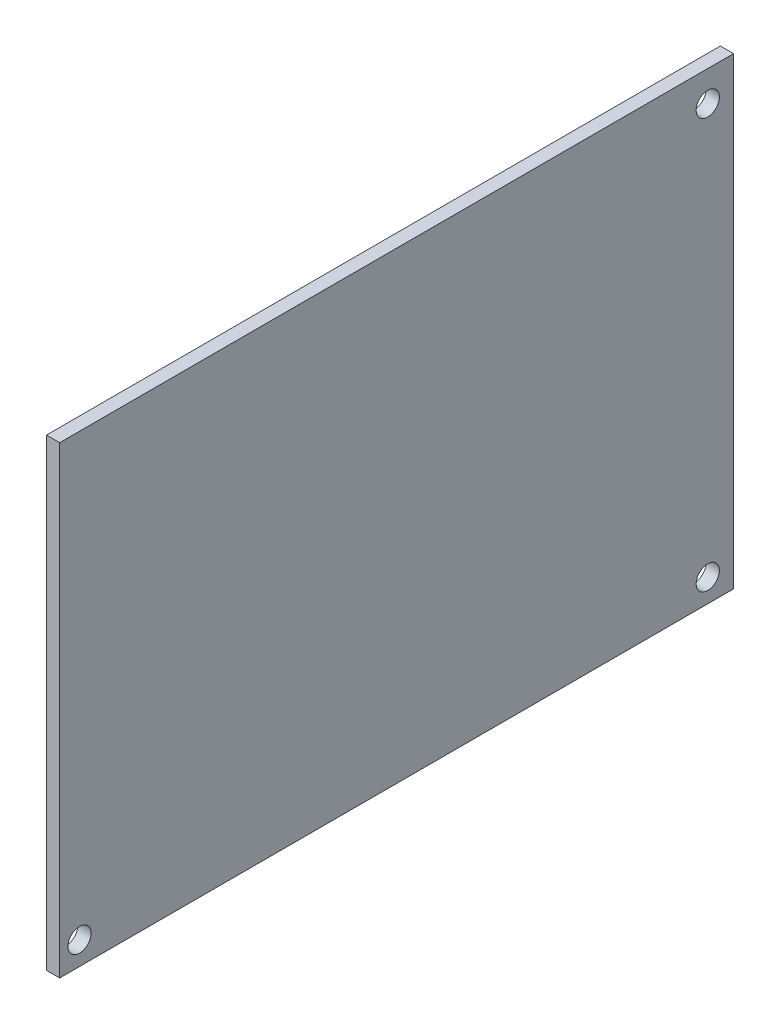
ISO-10303-21;
HEADER;
FILE_DESCRIPTION(('STEP AP214'),'2;1');
FILE_NAME('part.step','',(''),(''),'','','');
FILE_SCHEMA(('AUTOMOTIVE_DESIGN { 1 0 10303 214 1 1 1 1 }'));
ENDSEC;
DATA;
#1=APPLICATION_CONTEXT('core data for automotive mechanical design processes');
#2=APPLICATION_PROTOCOL_DEFINITION('international standard','automotive_design',2000,#1);
#3=PRODUCT_CONTEXT('',#1,'mechanical');
#4=PRODUCT('Part','Part','',(#3));
#5=PRODUCT_RELATED_PRODUCT_CATEGORY('part','',(#4));
#6=PRODUCT_DEFINITION_FORMATION('','',#4);
#7=PRODUCT_DEFINITION_CONTEXT('part definition',#1,'design');
#8=PRODUCT_DEFINITION('design','',#6,#7);
#9=PRODUCT_DEFINITION_SHAPE('','',#8);
#10=(LENGTH_UNIT() NAMED_UNIT(*) SI_UNIT(.MILLI.,.METRE.));
#11=(NAMED_UNIT(*) PLANE_ANGLE_UNIT() SI_UNIT($,.RADIAN.));
#12=(NAMED_UNIT(*) SI_UNIT($,.STERADIAN.) SOLID_ANGLE_UNIT());
#13=UNCERTAINTY_MEASURE_WITH_UNIT(LENGTH_MEASURE(1.E-05),#10,'distance_accuracy_value','');
#14=(GEOMETRIC_REPRESENTATION_CONTEXT(3) GLOBAL_UNCERTAINTY_ASSIGNED_CONTEXT((#13)) GLOBAL_UNIT_ASSIGNED_CONTEXT((#10,
#11,#12)) REPRESENTATION_CONTEXT('',''));
#15=CARTESIAN_POINT('',(0.,0.,0.));
#16=DIRECTION('',(0.,0.,1.));
#17=DIRECTION('',(1.,0.,0.));
#18=AXIS2_PLACEMENT_3D('',#15,#16,#17);
#19=CARTESIAN_POINT('',(3.71328924651546,28.4789231101329,109.500000000026));
#20=DIRECTION('',(-1.,0.,0.));
#21=DIRECTION('',(0.,-1.,0.));
#22=AXIS2_PLACEMENT_3D('',#19,#20,#21);
#23=PLANE('',#22);
#24=CARTESIAN_POINT('',(3.71328924651546,-38.1210768898671,106.500000000026));
#25=DIRECTION('',(1.,0.,0.));
#26=DIRECTION('',(0.,0.,-1.));
#27=AXIS2_PLACEMENT_3D('',#24,#25,#26);
#28=CIRCLE('',#27,1.75);
#29=CARTESIAN_POINT('',(3.71328924651546,-38.1210768898671,104.750000000026));
#30=VERTEX_POINT('',#29);
#31=EDGE_CURVE('E94',#30,#30,#28,.T.);
#32=ORIENTED_EDGE('',*,*,#31,.T.);
#33=EDGE_LOOP('',(#32));
#34=FACE_BOUND('',#33,.T.);
#35=CARTESIAN_POINT('',(3.71328924651546,-38.1210768898671,11.5000000000259));
#36=DIRECTION('',(1.,0.,0.));
#37=DIRECTION('',(0.,0.,-1.));
#38=AXIS2_PLACEMENT_3D('',#35,#36,#37);
#39=CIRCLE('',#38,1.75);
#40=CARTESIAN_POINT('',(3.71328924651546,-38.1210768898671,9.75000000002592));
#41=VERTEX_POINT('',#40);
#42=EDGE_CURVE('E118',#41,#41,#39,.T.);
#43=ORIENTED_EDGE('',*,*,#42,.T.);
#44=EDGE_LOOP('',(#43));
#45=FACE_BOUND('',#44,.T.);
#46=CARTESIAN_POINT('',(3.71328924651546,23.8789231101329,11.5000000000259));
#47=DIRECTION('',(1.,0.,0.));
#48=DIRECTION('',(0.,0.,-1.));
#49=AXIS2_PLACEMENT_3D('',#46,#47,#48);
#50=CIRCLE('',#49,1.75);
#51=CARTESIAN_POINT('',(3.71328924651546,23.8789231101329,9.75000000002592));
#52=VERTEX_POINT('',#51);
#53=EDGE_CURVE('E140',#52,#52,#50,.T.);
#54=ORIENTED_EDGE('',*,*,#53,.T.);
#55=EDGE_LOOP('',(#54));
#56=FACE_BOUND('',#55,.T.);
#57=DIRECTION('',(0.,-1.,0.));
#58=VECTOR('',#57,1.);
#59=CARTESIAN_POINT('',(3.71328924651546,-41.6210768898671,109.500000000026));
#60=LINE('',#59,#58);
#61=CARTESIAN_POINT('',(3.71328924651546,28.4789231101329,109.500000000026));
#62=VERTEX_POINT('',#61);
#63=CARTESIAN_POINT('',(3.71328924651546,-41.6210768898671,109.500000000026));
#64=VERTEX_POINT('',#63);
#65=EDGE_CURVE('E93',#62,#64,#60,.T.);
#66=ORIENTED_EDGE('',*,*,#65,.F.);
#67=DIRECTION('',(0.,0.,1.));
#68=VECTOR('',#67,1.);
#69=CARTESIAN_POINT('',(3.71328924651546,28.4789231101329,109.500000000026));
#70=LINE('',#69,#68);
#71=CARTESIAN_POINT('',(3.71328924651546,28.4789231101329,7.60000000002592));
#72=VERTEX_POINT('',#71);
#73=EDGE_CURVE('E20',#72,#62,#70,.T.);
#74=ORIENTED_EDGE('',*,*,#73,.F.);
#75=DIRECTION('',(0.,1.,0.));
#76=VECTOR('',#75,1.);
#77=CARTESIAN_POINT('',(3.71328924651546,-41.6210768898671,7.60000000002592));
#78=LINE('',#77,#76);
#79=CARTESIAN_POINT('',(3.71328924651546,-41.6210768898671,7.60000000002592));
#80=VERTEX_POINT('',#79);
#81=EDGE_CURVE('E119',#80,#72,#78,.T.);
#82=ORIENTED_EDGE('',*,*,#81,.F.);
#83=DIRECTION('',(0.,0.,-1.));
#84=VECTOR('',#83,1.);
#85=CARTESIAN_POINT('',(3.71328924651546,-41.6210768898671,109.500000000026));
#86=LINE('',#85,#84);
#87=EDGE_CURVE('E113',#64,#80,#86,.T.);
#88=ORIENTED_EDGE('',*,*,#87,.F.);
#89=EDGE_LOOP('',(#66,#74,#82,#88));
#90=FACE_BOUND('',#89,.T.);
#91=ADVANCED_FACE('F16',(#34,#45,#56,#90),#23,.T.);
#92=CARTESIAN_POINT('',(5.71328924651546,28.4789231101329,109.500000000026));
#93=DIRECTION('',(-1.,0.,0.));
#94=DIRECTION('',(0.,-1.,0.));
#95=AXIS2_PLACEMENT_3D('',#92,#93,#94);
#96=PLANE('',#95);
#97=CARTESIAN_POINT('',(5.71328924651546,-38.1210768898671,106.500000000026));
#98=DIRECTION('',(1.,0.,0.));
#99=DIRECTION('',(0.,0.,-1.));
#100=AXIS2_PLACEMENT_3D('',#97,#98,#99);
#101=CIRCLE('',#100,1.75);
#102=CARTESIAN_POINT('',(5.71328924651546,-38.1210768898671,104.750000000026));
#103=VERTEX_POINT('',#102);
#104=EDGE_CURVE('E88',#103,#103,#101,.T.);
#105=ORIENTED_EDGE('',*,*,#104,.F.);
#106=EDGE_LOOP('',(#105));
#107=FACE_BOUND('',#106,.T.);
#108=CARTESIAN_POINT('',(5.71328924651546,-38.1210768898671,11.5000000000259));
#109=DIRECTION('',(1.,0.,0.));
#110=DIRECTION('',(0.,0.,-1.));
#111=AXIS2_PLACEMENT_3D('',#108,#109,#110);
#112=CIRCLE('',#111,1.75);
#113=CARTESIAN_POINT('',(5.71328924651546,-38.1210768898671,9.75000000002592));
#114=VERTEX_POINT('',#113);
#115=EDGE_CURVE('E105',#114,#114,#112,.T.);
#116=ORIENTED_EDGE('',*,*,#115,.F.);
#117=EDGE_LOOP('',(#116));
#118=FACE_BOUND('',#117,.T.);
#119=CARTESIAN_POINT('',(5.71328924651546,23.8789231101329,11.5000000000259));
#120=DIRECTION('',(1.,0.,0.));
#121=DIRECTION('',(0.,0.,-1.));
#122=AXIS2_PLACEMENT_3D('',#119,#120,#121);
#123=CIRCLE('',#122,1.75);
#124=CARTESIAN_POINT('',(5.71328924651546,23.8789231101329,9.75000000002592));
#125=VERTEX_POINT('',#124);
#126=EDGE_CURVE('E129',#125,#125,#123,.T.);
#127=ORIENTED_EDGE('',*,*,#126,.F.);
#128=EDGE_LOOP('',(#127));
#129=FACE_BOUND('',#128,.T.);
#130=DIRECTION('',(0.,-1.,0.));
#131=VECTOR('',#130,1.);
#132=CARTESIAN_POINT('',(5.71328924651546,-41.6210768898671,109.500000000026));
#133=LINE('',#132,#131);
#134=CARTESIAN_POINT('',(5.71328924651546,28.4789231101329,109.500000000026));
#135=VERTEX_POINT('',#134);
#136=CARTESIAN_POINT('',(5.71328924651546,-41.6210768898671,109.500000000026));
#137=VERTEX_POINT('',#136);
#138=EDGE_CURVE('E114',#135,#137,#133,.T.);
#139=ORIENTED_EDGE('',*,*,#138,.T.);
#140=DIRECTION('',(0.,0.,-1.));
#141=VECTOR('',#140,1.);
#142=CARTESIAN_POINT('',(5.71328924651546,-41.6210768898671,109.500000000026));
#143=LINE('',#142,#141);
#144=CARTESIAN_POINT('',(5.71328924651546,-41.6210768898671,7.60000000002592));
#145=VERTEX_POINT('',#144);
#146=EDGE_CURVE('E122',#137,#145,#143,.T.);
#147=ORIENTED_EDGE('',*,*,#146,.T.);
#148=DIRECTION('',(0.,1.,0.));
#149=VECTOR('',#148,1.);
#150=CARTESIAN_POINT('',(5.71328924651546,-41.6210768898671,7.60000000002592));
#151=LINE('',#150,#149);
#152=CARTESIAN_POINT('',(5.71328924651546,28.4789231101329,7.60000000002592));
#153=VERTEX_POINT('',#152);
#154=EDGE_CURVE('E130',#145,#153,#151,.T.);
#155=ORIENTED_EDGE('',*,*,#154,.T.);
#156=DIRECTION('',(0.,0.,1.));
#157=VECTOR('',#156,1.);
#158=CARTESIAN_POINT('',(5.71328924651546,28.4789231101329,109.500000000026));
#159=LINE('',#158,#157);
#160=EDGE_CURVE('E11',#153,#135,#159,.T.);
#161=ORIENTED_EDGE('',*,*,#160,.T.);
#162=EDGE_LOOP('',(#139,#147,#155,#161));
#163=FACE_BOUND('',#162,.T.);
#164=ADVANCED_FACE('F150',(#107,#118,#129,#163),#96,.F.);
#165=CARTESIAN_POINT('',(5.71328924651546,28.4789231101329,109.500000000026));
#166=DIRECTION('',(0.,-1.,0.));
#167=DIRECTION('',(-1.,0.,0.));
#168=AXIS2_PLACEMENT_3D('',#165,#166,#167);
#169=PLANE('',#168);
#170=ORIENTED_EDGE('',*,*,#73,.T.);
#171=DIRECTION('',(-1.,0.,0.));
#172=VECTOR('',#171,1.);
#173=CARTESIAN_POINT('',(5.71328924651546,28.4789231101329,109.500000000026));
#174=LINE('',#173,#172);
#175=EDGE_CURVE('E111',#135,#62,#174,.T.);
#176=ORIENTED_EDGE('',*,*,#175,.F.);
#177=ORIENTED_EDGE('',*,*,#160,.F.);
#178=DIRECTION('',(-1.,0.,0.));
#179=VECTOR('',#178,1.);
#180=CARTESIAN_POINT('',(5.71328924651546,28.4789231101329,7.60000000002592));
#181=LINE('',#180,#179);
#182=EDGE_CURVE('E109',#153,#72,#181,.T.);
#183=ORIENTED_EDGE('',*,*,#182,.T.);
#184=EDGE_LOOP('',(#170,#176,#177,#183));
#185=FACE_BOUND('',#184,.T.);
#186=ADVANCED_FACE('F183',(#185),#169,.F.);
#187=CARTESIAN_POINT('',(5.71328924651546,-41.6210768898671,7.60000000002592));
#188=DIRECTION('',(0.,0.,1.));
#189=DIRECTION('',(1.,0.,0.));
#190=AXIS2_PLACEMENT_3D('',#187,#188,#189);
#191=PLANE('',#190);
#192=ORIENTED_EDGE('',*,*,#81,.T.);
#193=ORIENTED_EDGE('',*,*,#182,.F.);
#194=ORIENTED_EDGE('',*,*,#154,.F.);
#195=DIRECTION('',(-1.,0.,0.));
#196=VECTOR('',#195,1.);
#197=CARTESIAN_POINT('',(5.71328924651546,-41.6210768898671,7.60000000002592));
#198=LINE('',#197,#196);
#199=EDGE_CURVE('E136',#145,#80,#198,.T.);
#200=ORIENTED_EDGE('',*,*,#199,.T.);
#201=EDGE_LOOP('',(#192,#193,#194,#200));
#202=FACE_BOUND('',#201,.T.);
#203=ADVANCED_FACE('F157',(#202),#191,.F.);
#204=CARTESIAN_POINT('',(5.71328924651546,-41.6210768898671,109.500000000026));
#205=DIRECTION('',(0.,1.,0.));
#206=DIRECTION('',(0.,0.,-1.));
#207=AXIS2_PLACEMENT_3D('',#204,#205,#206);
#208=PLANE('',#207);
#209=ORIENTED_EDGE('',*,*,#87,.T.);
#210=ORIENTED_EDGE('',*,*,#199,.F.);
#211=ORIENTED_EDGE('',*,*,#146,.F.);
#212=DIRECTION('',(-1.,0.,0.));
#213=VECTOR('',#212,1.);
#214=CARTESIAN_POINT('',(5.71328924651546,-41.6210768898671,109.500000000026));
#215=LINE('',#214,#213);
#216=EDGE_CURVE('E102',#137,#64,#215,.T.);
#217=ORIENTED_EDGE('',*,*,#216,.T.);
#218=EDGE_LOOP('',(#209,#210,#211,#217));
#219=FACE_BOUND('',#218,.T.);
#220=ADVANCED_FACE('F18',(#219),#208,.F.);
#221=CARTESIAN_POINT('',(5.71328924651546,-41.6210768898671,109.500000000026));
#222=DIRECTION('',(0.,0.,-1.));
#223=DIRECTION('',(0.,1.,0.));
#224=AXIS2_PLACEMENT_3D('',#221,#222,#223);
#225=PLANE('',#224);
#226=ORIENTED_EDGE('',*,*,#65,.T.);
#227=ORIENTED_EDGE('',*,*,#216,.F.);
#228=ORIENTED_EDGE('',*,*,#138,.F.);
#229=ORIENTED_EDGE('',*,*,#175,.T.);
#230=EDGE_LOOP('',(#226,#227,#228,#229));
#231=FACE_BOUND('',#230,.T.);
#232=ADVANCED_FACE('F200',(#231),#225,.F.);
#233=CARTESIAN_POINT('',(3.71328924651546,-38.1210768898671,106.500000000026));
#234=DIRECTION('',(1.,0.,0.));
#235=DIRECTION('',(0.,0.,-1.));
#236=AXIS2_PLACEMENT_3D('',#233,#234,#235);
#237=CYLINDRICAL_SURFACE('',#236,1.75);
#238=ORIENTED_EDGE('',*,*,#104,.T.);
#239=EDGE_LOOP('',(#238));
#240=FACE_BOUND('',#239,.T.);
#241=ORIENTED_EDGE('',*,*,#31,.F.);
#242=EDGE_LOOP('',(#241));
#243=FACE_BOUND('',#242,.T.);
#244=ADVANCED_FACE('F89',(#240,#243),#237,.F.);
#245=CARTESIAN_POINT('',(3.71328924651546,-38.1210768898671,11.5000000000259));
#246=DIRECTION('',(1.,0.,0.));
#247=DIRECTION('',(0.,0.,-1.));
#248=AXIS2_PLACEMENT_3D('',#245,#246,#247);
#249=CYLINDRICAL_SURFACE('',#248,1.75);
#250=ORIENTED_EDGE('',*,*,#115,.T.);
#251=EDGE_LOOP('',(#250));
#252=FACE_BOUND('',#251,.T.);
#253=ORIENTED_EDGE('',*,*,#42,.F.);
#254=EDGE_LOOP('',(#253));
#255=FACE_BOUND('',#254,.T.);
#256=ADVANCED_FACE('F196',(#252,#255),#249,.F.);
#257=CARTESIAN_POINT('',(3.71328924651546,23.8789231101329,11.5000000000259));
#258=DIRECTION('',(1.,0.,0.));
#259=DIRECTION('',(0.,0.,-1.));
#260=AXIS2_PLACEMENT_3D('',#257,#258,#259);
#261=CYLINDRICAL_SURFACE('',#260,1.75);
#262=ORIENTED_EDGE('',*,*,#126,.T.);
#263=EDGE_LOOP('',(#262));
#264=FACE_BOUND('',#263,.T.);
#265=ORIENTED_EDGE('',*,*,#53,.F.);
#266=EDGE_LOOP('',(#265));
#267=FACE_BOUND('',#266,.T.);
#268=ADVANCED_FACE('F178',(#264,#267),#261,.F.);
#269=CLOSED_SHELL('',(#91,#164,#186,#203,#220,#232,#244,#256,#268));
#270=MANIFOLD_SOLID_BREP('B1',#269);
#271=ADVANCED_BREP_SHAPE_REPRESENTATION('',(#18,#270),#14);
#272=SHAPE_DEFINITION_REPRESENTATION(#9,#271);
ENDSEC;
END-ISO-10303-21;
